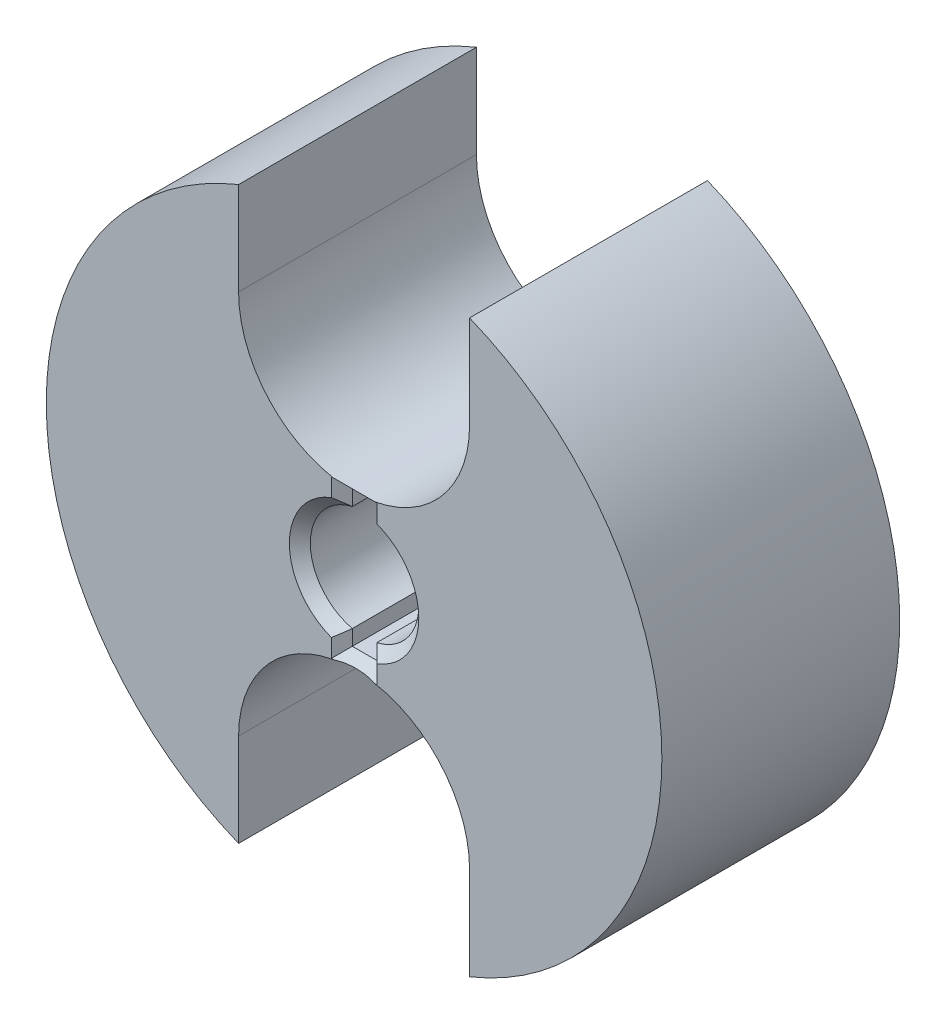
ISO-10303-21;
HEADER;
FILE_DESCRIPTION(('STEP AP214'),'2;1');
FILE_NAME('part.step','',(''),(''),'','','');
FILE_SCHEMA(('AUTOMOTIVE_DESIGN { 1 0 10303 214 1 1 1 1 }'));
ENDSEC;
DATA;
#1=APPLICATION_CONTEXT('core data for automotive mechanical design processes');
#2=APPLICATION_PROTOCOL_DEFINITION('international standard','automotive_design',2000,#1);
#3=PRODUCT_CONTEXT('',#1,'mechanical');
#4=PRODUCT('Part','Part','',(#3));
#5=PRODUCT_RELATED_PRODUCT_CATEGORY('part','',(#4));
#6=PRODUCT_DEFINITION_FORMATION('','',#4);
#7=PRODUCT_DEFINITION_CONTEXT('part definition',#1,'design');
#8=PRODUCT_DEFINITION('design','',#6,#7);
#9=PRODUCT_DEFINITION_SHAPE('','',#8);
#10=(LENGTH_UNIT() NAMED_UNIT(*) SI_UNIT(.MILLI.,.METRE.));
#11=(NAMED_UNIT(*) PLANE_ANGLE_UNIT() SI_UNIT($,.RADIAN.));
#12=(NAMED_UNIT(*) SI_UNIT($,.STERADIAN.) SOLID_ANGLE_UNIT());
#13=UNCERTAINTY_MEASURE_WITH_UNIT(LENGTH_MEASURE(1.E-05),#10,'distance_accuracy_value','');
#14=(GEOMETRIC_REPRESENTATION_CONTEXT(3) GLOBAL_UNCERTAINTY_ASSIGNED_CONTEXT((#13)) GLOBAL_UNIT_ASSIGNED_CONTEXT((#10,
#11,#12)) REPRESENTATION_CONTEXT('',''));
#15=CARTESIAN_POINT('',(0.,0.,0.));
#16=DIRECTION('',(0.,0.,1.));
#17=DIRECTION('',(1.,0.,0.));
#18=AXIS2_PLACEMENT_3D('',#15,#16,#17);
#19=CARTESIAN_POINT('',(0.,0.,17.));
#20=DIRECTION('',(0.,0.,1.));
#21=DIRECTION('',(1.,0.,0.));
#22=AXIS2_PLACEMENT_3D('',#19,#20,#21);
#23=PLANE('',#22);
#24=DIRECTION('',(0.,-1.,0.));
#25=VECTOR('',#24,1.);
#26=CARTESIAN_POINT('',(1.62499999999998,-4.875,17.));
#27=LINE('',#26,#25);
#28=CARTESIAN_POINT('',(1.62499999999998,-4.33012701892218,17.));
#29=VERTEX_POINT('',#28);
#30=CARTESIAN_POINT('',(1.62499999999998,-5.62499999999998,17.));
#31=VERTEX_POINT('',#30);
#32=EDGE_CURVE('E551',#29,#31,#27,.T.);
#33=ORIENTED_EDGE('',*,*,#32,.T.);
#34=DIRECTION('',(-1.,0.,0.));
#35=VECTOR('',#34,1.);
#36=CARTESIAN_POINT('',(0.,-5.62499999999998,17.));
#37=LINE('',#36,#35);
#38=CARTESIAN_POINT('',(1.48681707011984,-5.62499999999998,17.));
#39=VERTEX_POINT('',#38);
#40=EDGE_CURVE('E554',#31,#39,#37,.T.);
#41=ORIENTED_EDGE('',*,*,#40,.T.);
#42=CARTESIAN_POINT('',(0.,-13.745,17.));
#43=DIRECTION('',(0.,0.,1.));
#44=DIRECTION('',(1.,0.,0.));
#45=AXIS2_PLACEMENT_3D('',#42,#43,#44);
#46=CIRCLE('',#45,8.255);
#47=CARTESIAN_POINT('',(8.255,-13.745,17.));
#48=VERTEX_POINT('',#47);
#49=EDGE_CURVE('E275',#48,#39,#46,.T.);
#50=ORIENTED_EDGE('',*,*,#49,.F.);
#51=DIRECTION('',(0.,-1.,0.));
#52=VECTOR('',#51,1.);
#53=CARTESIAN_POINT('',(8.255,0.,17.));
#54=LINE('',#53,#52);
#55=CARTESIAN_POINT('',(8.25500000000001,-20.3925225266518,17.));
#56=VERTEX_POINT('',#55);
#57=EDGE_CURVE('E281',#48,#56,#54,.T.);
#58=ORIENTED_EDGE('',*,*,#57,.T.);
#59=CARTESIAN_POINT('',(0.,0.,17.));
#60=DIRECTION('',(0.,0.,1.));
#61=DIRECTION('',(1.,0.,0.));
#62=AXIS2_PLACEMENT_3D('',#59,#60,#61);
#63=CIRCLE('',#62,22.);
#64=CARTESIAN_POINT('',(8.255,20.3925225266518,17.));
#65=VERTEX_POINT('',#64);
#66=EDGE_CURVE('E285',#56,#65,#63,.T.);
#67=ORIENTED_EDGE('',*,*,#66,.T.);
#68=CARTESIAN_POINT('',(8.255,13.745,17.));
#69=VERTEX_POINT('',#68);
#70=EDGE_CURVE('E286',#65,#69,#54,.T.);
#71=ORIENTED_EDGE('',*,*,#70,.T.);
#72=CARTESIAN_POINT('',(0.,13.745,17.));
#73=DIRECTION('',(0.,0.,1.));
#74=DIRECTION('',(1.,0.,0.));
#75=AXIS2_PLACEMENT_3D('',#72,#73,#74);
#76=CIRCLE('',#75,8.255);
#77=CARTESIAN_POINT('',(1.48681707011984,5.62499999999998,17.));
#78=VERTEX_POINT('',#77);
#79=EDGE_CURVE('E292',#78,#69,#76,.T.);
#80=ORIENTED_EDGE('',*,*,#79,.F.);
#81=DIRECTION('',(1.,0.,0.));
#82=VECTOR('',#81,1.);
#83=CARTESIAN_POINT('',(0.874999999999999,5.62499999999998,17.));
#84=LINE('',#83,#82);
#85=CARTESIAN_POINT('',(1.62499999999998,5.62499999999998,17.));
#86=VERTEX_POINT('',#85);
#87=EDGE_CURVE('E542',#78,#86,#84,.T.);
#88=ORIENTED_EDGE('',*,*,#87,.T.);
#89=DIRECTION('',(0.,-1.,0.));
#90=VECTOR('',#89,1.);
#91=CARTESIAN_POINT('',(1.62499999999998,3.77491721763537,17.));
#92=LINE('',#91,#90);
#93=CARTESIAN_POINT('',(1.62499999999998,4.33012701892218,17.));
#94=VERTEX_POINT('',#93);
#95=EDGE_CURVE('E545',#86,#94,#92,.T.);
#96=ORIENTED_EDGE('',*,*,#95,.T.);
#97=CARTESIAN_POINT('',(0.,0.,17.));
#98=DIRECTION('',(0.,0.,1.));
#99=DIRECTION('',(1.,0.,0.));
#100=AXIS2_PLACEMENT_3D('',#97,#98,#99);
#101=CIRCLE('',#100,4.62499999999998);
#102=EDGE_CURVE('E548',#94,#29,#101,.F.);
#103=ORIENTED_EDGE('',*,*,#102,.T.);
#104=EDGE_LOOP('',(#33,#41,#50,#58,#67,#71,#80,#88,#96,#103));
#105=FACE_BOUND('',#104,.T.);
#106=ADVANCED_FACE('F47',(#105),#23,.T.);
#107=CARTESIAN_POINT('',(0.,0.,0.));
#108=DIRECTION('',(0.,0.,1.));
#109=DIRECTION('',(1.,0.,0.));
#110=AXIS2_PLACEMENT_3D('',#107,#108,#109);
#111=PLANE('',#110);
#112=DIRECTION('',(0.,-1.,0.));
#113=VECTOR('',#112,1.);
#114=CARTESIAN_POINT('',(-1.625,-4.875,0.));
#115=LINE('',#114,#113);
#116=CARTESIAN_POINT('',(-1.625,-4.3301270189222,0.));
#117=VERTEX_POINT('',#116);
#118=CARTESIAN_POINT('',(-1.625,-5.625,0.));
#119=VERTEX_POINT('',#118);
#120=EDGE_CURVE('E386',#117,#119,#115,.T.);
#121=ORIENTED_EDGE('',*,*,#120,.T.);
#122=DIRECTION('',(1.,0.,0.));
#123=VECTOR('',#122,1.);
#124=CARTESIAN_POINT('',(0.875000000000001,-5.625,0.));
#125=LINE('',#124,#123);
#126=CARTESIAN_POINT('',(-1.48681707011996,-5.625,0.));
#127=VERTEX_POINT('',#126);
#128=EDGE_CURVE('E389',#119,#127,#125,.T.);
#129=ORIENTED_EDGE('',*,*,#128,.T.);
#130=CARTESIAN_POINT('',(0.,-13.745,0.));
#131=DIRECTION('',(0.,0.,1.));
#132=DIRECTION('',(1.,0.,0.));
#133=AXIS2_PLACEMENT_3D('',#130,#131,#132);
#134=CIRCLE('',#133,8.255);
#135=CARTESIAN_POINT('',(-8.255,-13.745,0.));
#136=VERTEX_POINT('',#135);
#137=EDGE_CURVE('E305',#127,#136,#134,.T.);
#138=ORIENTED_EDGE('',*,*,#137,.T.);
#139=DIRECTION('',(0.,-1.,0.));
#140=VECTOR('',#139,1.);
#141=CARTESIAN_POINT('',(-8.255,0.,0.));
#142=LINE('',#141,#140);
#143=CARTESIAN_POINT('',(-8.255,-20.3925225266518,0.));
#144=VERTEX_POINT('',#143);
#145=EDGE_CURVE('E297',#136,#144,#142,.T.);
#146=ORIENTED_EDGE('',*,*,#145,.T.);
#147=CARTESIAN_POINT('',(0.,0.,0.));
#148=DIRECTION('',(0.,0.,1.));
#149=DIRECTION('',(1.,0.,0.));
#150=AXIS2_PLACEMENT_3D('',#147,#148,#149);
#151=CIRCLE('',#150,22.);
#152=CARTESIAN_POINT('',(-8.255,20.3925225266518,0.));
#153=VERTEX_POINT('',#152);
#154=EDGE_CURVE('E295',#153,#144,#151,.T.);
#155=ORIENTED_EDGE('',*,*,#154,.F.);
#156=CARTESIAN_POINT('',(-8.255,13.745,0.));
#157=VERTEX_POINT('',#156);
#158=EDGE_CURVE('E242',#153,#157,#142,.T.);
#159=ORIENTED_EDGE('',*,*,#158,.T.);
#160=CARTESIAN_POINT('',(0.,13.745,0.));
#161=DIRECTION('',(0.,0.,1.));
#162=DIRECTION('',(1.,0.,0.));
#163=AXIS2_PLACEMENT_3D('',#160,#161,#162);
#164=CIRCLE('',#163,8.255);
#165=CARTESIAN_POINT('',(-1.48681707011995,5.625,0.));
#166=VERTEX_POINT('',#165);
#167=EDGE_CURVE('E264',#157,#166,#164,.T.);
#168=ORIENTED_EDGE('',*,*,#167,.T.);
#169=DIRECTION('',(-1.,0.,0.));
#170=VECTOR('',#169,1.);
#171=CARTESIAN_POINT('',(0.,5.625,0.));
#172=LINE('',#171,#170);
#173=CARTESIAN_POINT('',(-1.62500000000001,5.625,0.));
#174=VERTEX_POINT('',#173);
#175=EDGE_CURVE('E377',#166,#174,#172,.T.);
#176=ORIENTED_EDGE('',*,*,#175,.T.);
#177=DIRECTION('',(0.,-1.,0.));
#178=VECTOR('',#177,1.);
#179=CARTESIAN_POINT('',(-1.625,3.77491721763537,0.));
#180=LINE('',#179,#178);
#181=CARTESIAN_POINT('',(-1.625,4.3301270189222,0.));
#182=VERTEX_POINT('',#181);
#183=EDGE_CURVE('E380',#174,#182,#180,.T.);
#184=ORIENTED_EDGE('',*,*,#183,.T.);
#185=CARTESIAN_POINT('',(0.,0.,0.));
#186=DIRECTION('',(0.,0.,1.));
#187=DIRECTION('',(1.,0.,0.));
#188=AXIS2_PLACEMENT_3D('',#185,#186,#187);
#189=CIRCLE('',#188,4.625);
#190=EDGE_CURVE('E383',#182,#117,#189,.T.);
#191=ORIENTED_EDGE('',*,*,#190,.T.);
#192=EDGE_LOOP('',(#121,#129,#138,#146,#155,#159,#168,#176,#184,#191));
#193=FACE_BOUND('',#192,.T.);
#194=ADVANCED_FACE('F679',(#193),#111,.F.);
#195=CARTESIAN_POINT('',(0.,0.,17.));
#196=DIRECTION('',(0.,0.,-1.));
#197=DIRECTION('',(-1.,0.,0.));
#198=AXIS2_PLACEMENT_3D('',#195,#196,#197);
#199=CYLINDRICAL_SURFACE('',#198,3.875);
#200=DIRECTION('',(0.,0.,-1.));
#201=VECTOR('',#200,1.);
#202=CARTESIAN_POINT('',(-0.875000000000001,3.77491721763537,17.));
#203=LINE('',#202,#201);
#204=CARTESIAN_POINT('',(-0.875000000000001,3.77491721763537,16.25));
#205=VERTEX_POINT('',#204);
#206=CARTESIAN_POINT('',(-0.875000000000001,3.77491721763537,0.750000000000004));
#207=VERTEX_POINT('',#206);
#208=EDGE_CURVE('E332',#205,#207,#203,.T.);
#209=ORIENTED_EDGE('',*,*,#208,.F.);
#210=CARTESIAN_POINT('',(0.,0.,16.25));
#211=DIRECTION('',(0.,0.,1.));
#212=DIRECTION('',(1.,0.,0.));
#213=AXIS2_PLACEMENT_3D('',#210,#211,#212);
#214=CIRCLE('',#213,3.875);
#215=CARTESIAN_POINT('',(-0.875,-3.77491721763537,16.25));
#216=VERTEX_POINT('',#215);
#217=EDGE_CURVE('E11',#205,#216,#214,.T.);
#218=ORIENTED_EDGE('',*,*,#217,.T.);
#219=DIRECTION('',(0.,0.,-1.));
#220=VECTOR('',#219,1.);
#221=CARTESIAN_POINT('',(-0.875,-3.77491721763537,17.));
#222=LINE('',#221,#220);
#223=CARTESIAN_POINT('',(-0.875,-3.77491721763537,0.750000000000004));
#224=VERTEX_POINT('',#223);
#225=EDGE_CURVE('E247',#216,#224,#222,.T.);
#226=ORIENTED_EDGE('',*,*,#225,.T.);
#227=CARTESIAN_POINT('',(0.,0.,0.750000000000004));
#228=DIRECTION('',(0.,0.,1.));
#229=DIRECTION('',(1.,0.,0.));
#230=AXIS2_PLACEMENT_3D('',#227,#228,#229);
#231=CIRCLE('',#230,3.875);
#232=EDGE_CURVE('E403',#224,#207,#231,.F.);
#233=ORIENTED_EDGE('',*,*,#232,.T.);
#234=EDGE_LOOP('',(#209,#218,#226,#233));
#235=FACE_BOUND('',#234,.T.);
#236=ADVANCED_FACE('F746',(#235),#199,.F.);
#237=CARTESIAN_POINT('',(-0.875,0.,17.));
#238=DIRECTION('',(1.,0.,0.));
#239=DIRECTION('',(0.,1.,0.));
#240=AXIS2_PLACEMENT_3D('',#237,#238,#239);
#241=PLANE('',#240);
#242=DIRECTION('',(0.,0.,-1.));
#243=VECTOR('',#242,1.);
#244=CARTESIAN_POINT('',(-0.875000000000001,4.875,17.));
#245=LINE('',#244,#243);
#246=CARTESIAN_POINT('',(-0.875000000000001,4.875,16.25));
#247=VERTEX_POINT('',#246);
#248=CARTESIAN_POINT('',(-0.875000000000001,4.875,0.750000000000004));
#249=VERTEX_POINT('',#248);
#250=EDGE_CURVE('E329',#247,#249,#245,.T.);
#251=ORIENTED_EDGE('',*,*,#250,.F.);
#252=DIRECTION('',(0.,-1.,0.));
#253=VECTOR('',#252,1.);
#254=CARTESIAN_POINT('',(-0.875,0.,16.25));
#255=LINE('',#254,#253);
#256=EDGE_CURVE('E58',#247,#205,#255,.T.);
#257=ORIENTED_EDGE('',*,*,#256,.T.);
#258=ORIENTED_EDGE('',*,*,#208,.T.);
#259=DIRECTION('',(0.,1.,0.));
#260=VECTOR('',#259,1.);
#261=CARTESIAN_POINT('',(-0.875000000000001,4.875,0.750000000000004));
#262=LINE('',#261,#260);
#263=EDGE_CURVE('E407',#207,#249,#262,.T.);
#264=ORIENTED_EDGE('',*,*,#263,.T.);
#265=EDGE_LOOP('',(#251,#257,#258,#264));
#266=FACE_BOUND('',#265,.T.);
#267=ADVANCED_FACE('F749',(#266),#241,.T.);
#268=CARTESIAN_POINT('',(0.,4.875,17.));
#269=DIRECTION('',(0.,1.,0.));
#270=DIRECTION('',(0.,0.,1.));
#271=AXIS2_PLACEMENT_3D('',#268,#269,#270);
#272=PLANE('',#271);
#273=DIRECTION('',(0.,0.,-1.));
#274=VECTOR('',#273,1.);
#275=CARTESIAN_POINT('',(0.874999999999999,4.875,17.));
#276=LINE('',#275,#274);
#277=CARTESIAN_POINT('',(0.874999999999999,4.875,16.25));
#278=VERTEX_POINT('',#277);
#279=CARTESIAN_POINT('',(0.874999999999999,4.875,0.750000000000004));
#280=VERTEX_POINT('',#279);
#281=EDGE_CURVE('E326',#278,#280,#276,.T.);
#282=ORIENTED_EDGE('',*,*,#281,.F.);
#283=DIRECTION('',(-1.,0.,0.));
#284=VECTOR('',#283,1.);
#285=CARTESIAN_POINT('',(-0.875000000000001,4.875,16.25));
#286=LINE('',#285,#284);
#287=EDGE_CURVE('E73',#278,#247,#286,.T.);
#288=ORIENTED_EDGE('',*,*,#287,.T.);
#289=ORIENTED_EDGE('',*,*,#250,.T.);
#290=DIRECTION('',(1.,0.,0.));
#291=VECTOR('',#290,1.);
#292=CARTESIAN_POINT('',(0.,4.875,0.750000000000004));
#293=LINE('',#292,#291);
#294=EDGE_CURVE('E411',#249,#280,#293,.T.);
#295=ORIENTED_EDGE('',*,*,#294,.T.);
#296=EDGE_LOOP('',(#282,#288,#289,#295));
#297=FACE_BOUND('',#296,.T.);
#298=ADVANCED_FACE('F750',(#297),#272,.F.);
#299=CARTESIAN_POINT('',(0.875,0.,17.));
#300=DIRECTION('',(1.,0.,0.));
#301=DIRECTION('',(0.,1.,0.));
#302=AXIS2_PLACEMENT_3D('',#299,#300,#301);
#303=PLANE('',#302);
#304=DIRECTION('',(0.,0.,-1.));
#305=VECTOR('',#304,1.);
#306=CARTESIAN_POINT('',(0.874999999999999,3.77491721763537,17.));
#307=LINE('',#306,#305);
#308=CARTESIAN_POINT('',(0.874999999999999,3.77491721763537,16.25));
#309=VERTEX_POINT('',#308);
#310=CARTESIAN_POINT('',(0.874999999999999,3.77491721763537,0.750000000000004));
#311=VERTEX_POINT('',#310);
#312=EDGE_CURVE('E323',#309,#311,#307,.T.);
#313=ORIENTED_EDGE('',*,*,#312,.F.);
#314=DIRECTION('',(0.,1.,0.));
#315=VECTOR('',#314,1.);
#316=CARTESIAN_POINT('',(0.874999999999999,4.875,16.25));
#317=LINE('',#316,#315);
#318=EDGE_CURVE('E569',#309,#278,#317,.T.);
#319=ORIENTED_EDGE('',*,*,#318,.T.);
#320=ORIENTED_EDGE('',*,*,#281,.T.);
#321=DIRECTION('',(0.,-1.,0.));
#322=VECTOR('',#321,1.);
#323=CARTESIAN_POINT('',(0.875,0.,0.750000000000004));
#324=LINE('',#323,#322);
#325=EDGE_CURVE('E418',#280,#311,#324,.T.);
#326=ORIENTED_EDGE('',*,*,#325,.T.);
#327=EDGE_LOOP('',(#313,#319,#320,#326));
#328=FACE_BOUND('',#327,.T.);
#329=ADVANCED_FACE('F779',(#328),#303,.F.);
#330=DIRECTION('',(0.,0.,-1.));
#331=VECTOR('',#330,1.);
#332=CARTESIAN_POINT('',(0.875,-3.77491721763537,17.));
#333=LINE('',#332,#331);
#334=CARTESIAN_POINT('',(0.875,-3.77491721763537,16.25));
#335=VERTEX_POINT('',#334);
#336=CARTESIAN_POINT('',(0.875,-3.77491721763537,0.750000000000004));
#337=VERTEX_POINT('',#336);
#338=EDGE_CURVE('E320',#335,#337,#333,.T.);
#339=ORIENTED_EDGE('',*,*,#338,.F.);
#340=CARTESIAN_POINT('',(0.,0.,16.25));
#341=DIRECTION('',(0.,0.,1.));
#342=DIRECTION('',(1.,0.,0.));
#343=AXIS2_PLACEMENT_3D('',#340,#341,#342);
#344=CIRCLE('',#343,3.875);
#345=EDGE_CURVE('E566',#335,#309,#344,.T.);
#346=ORIENTED_EDGE('',*,*,#345,.T.);
#347=ORIENTED_EDGE('',*,*,#312,.T.);
#348=CARTESIAN_POINT('',(0.,0.,0.750000000000004));
#349=DIRECTION('',(0.,0.,1.));
#350=DIRECTION('',(1.,0.,0.));
#351=AXIS2_PLACEMENT_3D('',#348,#349,#350);
#352=CIRCLE('',#351,3.875);
#353=EDGE_CURVE('E422',#311,#337,#352,.F.);
#354=ORIENTED_EDGE('',*,*,#353,.T.);
#355=EDGE_LOOP('',(#339,#346,#347,#354));
#356=FACE_BOUND('',#355,.T.);
#357=ADVANCED_FACE('F782',(#356),#199,.F.);
#358=DIRECTION('',(0.,0.,-1.));
#359=VECTOR('',#358,1.);
#360=CARTESIAN_POINT('',(0.875000000000001,-4.875,17.));
#361=LINE('',#360,#359);
#362=CARTESIAN_POINT('',(0.875000000000001,-4.875,16.25));
#363=VERTEX_POINT('',#362);
#364=CARTESIAN_POINT('',(0.875000000000001,-4.875,0.750000000000004));
#365=VERTEX_POINT('',#364);
#366=EDGE_CURVE('E317',#363,#365,#361,.T.);
#367=ORIENTED_EDGE('',*,*,#366,.F.);
#368=DIRECTION('',(0.,1.,0.));
#369=VECTOR('',#368,1.);
#370=CARTESIAN_POINT('',(0.875,-3.77491721763537,16.25));
#371=LINE('',#370,#369);
#372=EDGE_CURVE('E563',#363,#335,#371,.T.);
#373=ORIENTED_EDGE('',*,*,#372,.T.);
#374=ORIENTED_EDGE('',*,*,#338,.T.);
#375=DIRECTION('',(0.,-1.,0.));
#376=VECTOR('',#375,1.);
#377=CARTESIAN_POINT('',(0.875,0.,0.750000000000004));
#378=LINE('',#377,#376);
#379=EDGE_CURVE('E335',#337,#365,#378,.T.);
#380=ORIENTED_EDGE('',*,*,#379,.T.);
#381=EDGE_LOOP('',(#367,#373,#374,#380));
#382=FACE_BOUND('',#381,.T.);
#383=ADVANCED_FACE('F787',(#382),#303,.F.);
#384=CARTESIAN_POINT('',(0.,-4.875,17.));
#385=DIRECTION('',(0.,1.,0.));
#386=DIRECTION('',(0.,0.,1.));
#387=AXIS2_PLACEMENT_3D('',#384,#385,#386);
#388=PLANE('',#387);
#389=DIRECTION('',(0.,0.,-1.));
#390=VECTOR('',#389,1.);
#391=CARTESIAN_POINT('',(-0.874999999999999,-4.875,17.));
#392=LINE('',#391,#390);
#393=CARTESIAN_POINT('',(-0.874999999999999,-4.875,16.25));
#394=VERTEX_POINT('',#393);
#395=CARTESIAN_POINT('',(-0.874999999999999,-4.875,0.750000000000004));
#396=VERTEX_POINT('',#395);
#397=EDGE_CURVE('E314',#394,#396,#392,.T.);
#398=ORIENTED_EDGE('',*,*,#397,.F.);
#399=DIRECTION('',(1.,0.,0.));
#400=VECTOR('',#399,1.);
#401=CARTESIAN_POINT('',(0.,-4.875,16.25));
#402=LINE('',#401,#400);
#403=EDGE_CURVE('E557',#394,#363,#402,.T.);
#404=ORIENTED_EDGE('',*,*,#403,.T.);
#405=ORIENTED_EDGE('',*,*,#366,.T.);
#406=DIRECTION('',(-1.,0.,0.));
#407=VECTOR('',#406,1.);
#408=CARTESIAN_POINT('',(-0.874999999999999,-4.875,0.750000000000004));
#409=LINE('',#408,#407);
#410=EDGE_CURVE('E395',#365,#396,#409,.T.);
#411=ORIENTED_EDGE('',*,*,#410,.T.);
#412=EDGE_LOOP('',(#398,#404,#405,#411));
#413=FACE_BOUND('',#412,.T.);
#414=ADVANCED_FACE('F793',(#413),#388,.T.);
#415=CARTESIAN_POINT('',(-8.255,0.,17.));
#416=DIRECTION('',(1.,0.,0.));
#417=DIRECTION('',(0.,1.,0.));
#418=AXIS2_PLACEMENT_3D('',#415,#416,#417);
#419=PLANE('',#418);
#420=ORIENTED_EDGE('',*,*,#158,.F.);
#421=DIRECTION('',(0.,0.,-1.));
#422=VECTOR('',#421,1.);
#423=CARTESIAN_POINT('',(-8.255,20.3925225266518,17.));
#424=LINE('',#423,#422);
#425=CARTESIAN_POINT('',(-8.255,20.3925225266518,17.));
#426=VERTEX_POINT('',#425);
#427=EDGE_CURVE('E235',#426,#153,#424,.T.);
#428=ORIENTED_EDGE('',*,*,#427,.F.);
#429=DIRECTION('',(0.,-1.,0.));
#430=VECTOR('',#429,1.);
#431=CARTESIAN_POINT('',(-8.255,0.,17.));
#432=LINE('',#431,#430);
#433=CARTESIAN_POINT('',(-8.255,13.745,17.));
#434=VERTEX_POINT('',#433);
#435=EDGE_CURVE('E239',#426,#434,#432,.T.);
#436=ORIENTED_EDGE('',*,*,#435,.T.);
#437=DIRECTION('',(0.,0.,-1.));
#438=VECTOR('',#437,1.);
#439=CARTESIAN_POINT('',(-8.255,13.745,17.));
#440=LINE('',#439,#438);
#441=EDGE_CURVE('E291',#434,#157,#440,.T.);
#442=ORIENTED_EDGE('',*,*,#441,.T.);
#443=EDGE_LOOP('',(#420,#428,#436,#442));
#444=FACE_BOUND('',#443,.T.);
#445=ADVANCED_FACE('F237',(#444),#419,.T.);
#446=CARTESIAN_POINT('',(0.,0.,17.));
#447=DIRECTION('',(0.,0.,-1.));
#448=DIRECTION('',(-1.,0.,0.));
#449=AXIS2_PLACEMENT_3D('',#446,#447,#448);
#450=CYLINDRICAL_SURFACE('',#449,22.);
#451=ORIENTED_EDGE('',*,*,#154,.T.);
#452=DIRECTION('',(0.,0.,-1.));
#453=VECTOR('',#452,1.);
#454=CARTESIAN_POINT('',(-8.255,-20.3925225266518,17.));
#455=LINE('',#454,#453);
#456=CARTESIAN_POINT('',(-8.255,-20.3925225266518,17.));
#457=VERTEX_POINT('',#456);
#458=EDGE_CURVE('E248',#457,#144,#455,.T.);
#459=ORIENTED_EDGE('',*,*,#458,.F.);
#460=CARTESIAN_POINT('',(0.,0.,17.));
#461=DIRECTION('',(0.,0.,1.));
#462=DIRECTION('',(1.,0.,0.));
#463=AXIS2_PLACEMENT_3D('',#460,#461,#462);
#464=CIRCLE('',#463,22.);
#465=EDGE_CURVE('E251',#426,#457,#464,.T.);
#466=ORIENTED_EDGE('',*,*,#465,.F.);
#467=ORIENTED_EDGE('',*,*,#427,.T.);
#468=EDGE_LOOP('',(#451,#459,#466,#467));
#469=FACE_BOUND('',#468,.T.);
#470=ADVANCED_FACE('F252',(#469),#450,.T.);
#471=ORIENTED_EDGE('',*,*,#145,.F.);
#472=DIRECTION('',(0.,0.,-1.));
#473=VECTOR('',#472,1.);
#474=CARTESIAN_POINT('',(-8.255,-13.745,17.));
#475=LINE('',#474,#473);
#476=CARTESIAN_POINT('',(-8.255,-13.745,17.));
#477=VERTEX_POINT('',#476);
#478=EDGE_CURVE('E353',#477,#136,#475,.T.);
#479=ORIENTED_EDGE('',*,*,#478,.F.);
#480=EDGE_CURVE('E257',#477,#457,#432,.T.);
#481=ORIENTED_EDGE('',*,*,#480,.T.);
#482=ORIENTED_EDGE('',*,*,#458,.T.);
#483=EDGE_LOOP('',(#471,#479,#481,#482));
#484=FACE_BOUND('',#483,.T.);
#485=ADVANCED_FACE('F818',(#484),#419,.T.);
#486=CARTESIAN_POINT('',(0.,-13.745,17.));
#487=DIRECTION('',(0.,0.,-1.));
#488=DIRECTION('',(-1.,0.,0.));
#489=AXIS2_PLACEMENT_3D('',#486,#487,#488);
#490=CYLINDRICAL_SURFACE('',#489,8.255);
#491=ORIENTED_EDGE('',*,*,#49,.T.);
#492=CARTESIAN_POINT('',(0.,-13.745,25.12));
#493=DIRECTION('',(0.,-0.707106781186547,-0.707106781186547));
#494=DIRECTION('',(0.,0.707106781186548,-0.707106781186548));
#495=AXIS2_PLACEMENT_3D('',#492,#493,#494);
#496=ELLIPSE('',#495,11.6743329573899,8.255);
#497=CARTESIAN_POINT('',(-1.48681707011984,-5.62499999999998,17.));
#498=VERTEX_POINT('',#497);
#499=EDGE_CURVE('E560',#39,#498,#496,.F.);
#500=ORIENTED_EDGE('',*,*,#499,.T.);
#501=EDGE_CURVE('E271',#498,#477,#46,.T.);
#502=ORIENTED_EDGE('',*,*,#501,.T.);
#503=ORIENTED_EDGE('',*,*,#478,.T.);
#504=ORIENTED_EDGE('',*,*,#137,.F.);
#505=CARTESIAN_POINT('',(0.,-13.745,-8.12));
#506=DIRECTION('',(0.,0.707106781186548,-0.707106781186548));
#507=DIRECTION('',(0.,-0.707106781186548,-0.707106781186548));
#508=AXIS2_PLACEMENT_3D('',#505,#506,#507);
#509=ELLIPSE('',#508,11.6743329573899,8.255);
#510=CARTESIAN_POINT('',(1.48681707011996,-5.625,0.));
#511=VERTEX_POINT('',#510);
#512=EDGE_CURVE('E392',#127,#511,#509,.T.);
#513=ORIENTED_EDGE('',*,*,#512,.T.);
#514=CARTESIAN_POINT('',(8.255,-13.745,0.));
#515=VERTEX_POINT('',#514);
#516=EDGE_CURVE('E300',#515,#511,#134,.T.);
#517=ORIENTED_EDGE('',*,*,#516,.F.);
#518=DIRECTION('',(0.,0.,-1.));
#519=VECTOR('',#518,1.);
#520=CARTESIAN_POINT('',(8.255,-13.745,17.));
#521=LINE('',#520,#519);
#522=EDGE_CURVE('E350',#48,#515,#521,.T.);
#523=ORIENTED_EDGE('',*,*,#522,.F.);
#524=EDGE_LOOP('',(#491,#500,#502,#503,#504,#513,#517,#523));
#525=FACE_BOUND('',#524,.T.);
#526=ADVANCED_FACE('F709',(#525),#490,.F.);
#527=CARTESIAN_POINT('',(8.255,0.,17.));
#528=DIRECTION('',(1.,0.,0.));
#529=DIRECTION('',(0.,1.,0.));
#530=AXIS2_PLACEMENT_3D('',#527,#528,#529);
#531=PLANE('',#530);
#532=DIRECTION('',(0.,-1.,0.));
#533=VECTOR('',#532,1.);
#534=CARTESIAN_POINT('',(8.255,0.,0.));
#535=LINE('',#534,#533);
#536=CARTESIAN_POINT('',(8.25500000000001,-20.3925225266518,0.));
#537=VERTEX_POINT('',#536);
#538=EDGE_CURVE('E304',#515,#537,#535,.T.);
#539=ORIENTED_EDGE('',*,*,#538,.T.);
#540=DIRECTION('',(0.,0.,-1.));
#541=VECTOR('',#540,1.);
#542=CARTESIAN_POINT('',(8.25500000000001,-20.3925225266518,17.));
#543=LINE('',#542,#541);
#544=EDGE_CURVE('E346',#56,#537,#543,.T.);
#545=ORIENTED_EDGE('',*,*,#544,.F.);
#546=ORIENTED_EDGE('',*,*,#57,.F.);
#547=ORIENTED_EDGE('',*,*,#522,.T.);
#548=EDGE_LOOP('',(#539,#545,#546,#547));
#549=FACE_BOUND('',#548,.T.);
#550=ADVANCED_FACE('F809',(#549),#531,.F.);
#551=CARTESIAN_POINT('',(0.,0.,17.));
#552=DIRECTION('',(0.,0.,-1.));
#553=DIRECTION('',(-1.,0.,0.));
#554=AXIS2_PLACEMENT_3D('',#551,#552,#553);
#555=CYLINDRICAL_SURFACE('',#554,22.);
#556=CARTESIAN_POINT('',(0.,0.,0.));
#557=DIRECTION('',(0.,0.,1.));
#558=DIRECTION('',(1.,0.,0.));
#559=AXIS2_PLACEMENT_3D('',#556,#557,#558);
#560=CIRCLE('',#559,22.);
#561=CARTESIAN_POINT('',(8.255,20.3925225266518,0.));
#562=VERTEX_POINT('',#561);
#563=EDGE_CURVE('E308',#537,#562,#560,.T.);
#564=ORIENTED_EDGE('',*,*,#563,.T.);
#565=DIRECTION('',(0.,0.,-1.));
#566=VECTOR('',#565,1.);
#567=CARTESIAN_POINT('',(8.255,20.3925225266518,17.));
#568=LINE('',#567,#566);
#569=EDGE_CURVE('E342',#65,#562,#568,.T.);
#570=ORIENTED_EDGE('',*,*,#569,.F.);
#571=ORIENTED_EDGE('',*,*,#66,.F.);
#572=ORIENTED_EDGE('',*,*,#544,.T.);
#573=EDGE_LOOP('',(#564,#570,#571,#572));
#574=FACE_BOUND('',#573,.T.);
#575=ADVANCED_FACE('F703',(#574),#555,.T.);
#576=CARTESIAN_POINT('',(8.255,13.745,0.));
#577=VERTEX_POINT('',#576);
#578=EDGE_CURVE('E309',#562,#577,#535,.T.);
#579=ORIENTED_EDGE('',*,*,#578,.T.);
#580=DIRECTION('',(0.,0.,-1.));
#581=VECTOR('',#580,1.);
#582=CARTESIAN_POINT('',(8.255,13.745,17.));
#583=LINE('',#582,#581);
#584=EDGE_CURVE('E338',#69,#577,#583,.T.);
#585=ORIENTED_EDGE('',*,*,#584,.F.);
#586=ORIENTED_EDGE('',*,*,#70,.F.);
#587=ORIENTED_EDGE('',*,*,#569,.T.);
#588=EDGE_LOOP('',(#579,#585,#586,#587));
#589=FACE_BOUND('',#588,.T.);
#590=ADVANCED_FACE('F699',(#589),#531,.F.);
#591=CARTESIAN_POINT('',(0.,13.745,17.));
#592=DIRECTION('',(0.,0.,-1.));
#593=DIRECTION('',(-1.,0.,0.));
#594=AXIS2_PLACEMENT_3D('',#591,#592,#593);
#595=CYLINDRICAL_SURFACE('',#594,8.255);
#596=CARTESIAN_POINT('',(-1.48681707011984,5.62499999999998,17.));
#597=VERTEX_POINT('',#596);
#598=EDGE_CURVE('E262',#434,#597,#76,.T.);
#599=ORIENTED_EDGE('',*,*,#598,.T.);
#600=CARTESIAN_POINT('',(0.,13.745,25.12));
#601=DIRECTION('',(0.,-0.707106781186547,0.707106781186547));
#602=DIRECTION('',(0.,-0.707106781186548,-0.707106781186548));
#603=AXIS2_PLACEMENT_3D('',#600,#601,#602);
#604=ELLIPSE('',#603,11.6743329573899,8.255);
#605=EDGE_CURVE('E572',#597,#78,#604,.T.);
#606=ORIENTED_EDGE('',*,*,#605,.T.);
#607=ORIENTED_EDGE('',*,*,#79,.T.);
#608=ORIENTED_EDGE('',*,*,#584,.T.);
#609=CARTESIAN_POINT('',(1.48681707011995,5.625,0.));
#610=VERTEX_POINT('',#609);
#611=EDGE_CURVE('E268',#610,#577,#164,.T.);
#612=ORIENTED_EDGE('',*,*,#611,.F.);
#613=CARTESIAN_POINT('',(0.,13.745,-8.12));
#614=DIRECTION('',(0.,0.707106781186548,0.707106781186548));
#615=DIRECTION('',(0.,0.707106781186548,-0.707106781186548));
#616=AXIS2_PLACEMENT_3D('',#613,#614,#615);
#617=ELLIPSE('',#616,11.6743329573899,8.255);
#618=EDGE_CURVE('E415',#610,#166,#617,.F.);
#619=ORIENTED_EDGE('',*,*,#618,.T.);
#620=ORIENTED_EDGE('',*,*,#167,.F.);
#621=ORIENTED_EDGE('',*,*,#441,.F.);
#622=EDGE_LOOP('',(#599,#606,#607,#608,#612,#619,#620,#621));
#623=FACE_BOUND('',#622,.T.);
#624=ADVANCED_FACE('F675',(#623),#595,.F.);
#625=ORIENTED_EDGE('',*,*,#225,.F.);
#626=DIRECTION('',(0.,-1.,0.));
#627=VECTOR('',#626,1.);
#628=CARTESIAN_POINT('',(-0.875,0.,16.25));
#629=LINE('',#628,#627);
#630=EDGE_CURVE('E426',#216,#394,#629,.T.);
#631=ORIENTED_EDGE('',*,*,#630,.T.);
#632=ORIENTED_EDGE('',*,*,#397,.T.);
#633=DIRECTION('',(0.,1.,0.));
#634=VECTOR('',#633,1.);
#635=CARTESIAN_POINT('',(-0.875,-3.77491721763537,0.750000000000004));
#636=LINE('',#635,#634);
#637=EDGE_CURVE('E399',#396,#224,#636,.T.);
#638=ORIENTED_EDGE('',*,*,#637,.T.);
#639=EDGE_LOOP('',(#625,#631,#632,#638));
#640=FACE_BOUND('',#639,.T.);
#641=ADVANCED_FACE('F738',(#640),#241,.T.);
#642=ORIENTED_EDGE('',*,*,#501,.F.);
#643=DIRECTION('',(-1.,0.,0.));
#644=VECTOR('',#643,1.);
#645=CARTESIAN_POINT('',(0.,-5.62499999999998,17.));
#646=LINE('',#645,#644);
#647=CARTESIAN_POINT('',(-1.62499999999998,-5.62499999999998,17.));
#648=VERTEX_POINT('',#647);
#649=EDGE_CURVE('E539',#498,#648,#646,.T.);
#650=ORIENTED_EDGE('',*,*,#649,.T.);
#651=DIRECTION('',(0.,1.,0.));
#652=VECTOR('',#651,1.);
#653=CARTESIAN_POINT('',(-1.62499999999998,0.,17.));
#654=LINE('',#653,#652);
#655=CARTESIAN_POINT('',(-1.62499999999998,-4.33012701892218,17.));
#656=VERTEX_POINT('',#655);
#657=EDGE_CURVE('E535',#648,#656,#654,.T.);
#658=ORIENTED_EDGE('',*,*,#657,.T.);
#659=CARTESIAN_POINT('',(0.,0.,17.));
#660=DIRECTION('',(0.,0.,1.));
#661=DIRECTION('',(1.,0.,0.));
#662=AXIS2_PLACEMENT_3D('',#659,#660,#661);
#663=CIRCLE('',#662,4.62499999999998);
#664=CARTESIAN_POINT('',(-1.62499999999998,4.33012701892218,17.));
#665=VERTEX_POINT('',#664);
#666=EDGE_CURVE('E526',#656,#665,#663,.F.);
#667=ORIENTED_EDGE('',*,*,#666,.T.);
#668=DIRECTION('',(0.,1.,0.));
#669=VECTOR('',#668,1.);
#670=CARTESIAN_POINT('',(-1.62499999999998,0.,17.));
#671=LINE('',#670,#669);
#672=CARTESIAN_POINT('',(-1.62499999999998,5.62499999999998,17.));
#673=VERTEX_POINT('',#672);
#674=EDGE_CURVE('E529',#665,#673,#671,.T.);
#675=ORIENTED_EDGE('',*,*,#674,.T.);
#676=DIRECTION('',(1.,0.,0.));
#677=VECTOR('',#676,1.);
#678=CARTESIAN_POINT('',(0.874999999999999,5.62499999999998,17.));
#679=LINE('',#678,#677);
#680=EDGE_CURVE('E532',#673,#597,#679,.T.);
#681=ORIENTED_EDGE('',*,*,#680,.T.);
#682=ORIENTED_EDGE('',*,*,#598,.F.);
#683=ORIENTED_EDGE('',*,*,#435,.F.);
#684=ORIENTED_EDGE('',*,*,#465,.T.);
#685=ORIENTED_EDGE('',*,*,#480,.F.);
#686=EDGE_LOOP('',(#642,#650,#658,#667,#675,#681,#682,#683,#684,#685));
#687=FACE_BOUND('',#686,.T.);
#688=ADVANCED_FACE('F260',(#687),#23,.T.);
#689=ORIENTED_EDGE('',*,*,#516,.T.);
#690=DIRECTION('',(1.,0.,0.));
#691=VECTOR('',#690,1.);
#692=CARTESIAN_POINT('',(0.875000000000001,-5.625,0.));
#693=LINE('',#692,#691);
#694=CARTESIAN_POINT('',(1.625,-5.625,0.));
#695=VERTEX_POINT('',#694);
#696=EDGE_CURVE('E374',#511,#695,#693,.T.);
#697=ORIENTED_EDGE('',*,*,#696,.T.);
#698=DIRECTION('',(0.,1.,0.));
#699=VECTOR('',#698,1.);
#700=CARTESIAN_POINT('',(1.625,0.,0.));
#701=LINE('',#700,#699);
#702=CARTESIAN_POINT('',(1.625,-4.3301270189222,0.));
#703=VERTEX_POINT('',#702);
#704=EDGE_CURVE('E370',#695,#703,#701,.T.);
#705=ORIENTED_EDGE('',*,*,#704,.T.);
#706=CARTESIAN_POINT('',(0.,0.,0.));
#707=DIRECTION('',(0.,0.,1.));
#708=DIRECTION('',(1.,0.,0.));
#709=AXIS2_PLACEMENT_3D('',#706,#707,#708);
#710=CIRCLE('',#709,4.625);
#711=CARTESIAN_POINT('',(1.625,4.3301270189222,0.));
#712=VERTEX_POINT('',#711);
#713=EDGE_CURVE('E361',#703,#712,#710,.T.);
#714=ORIENTED_EDGE('',*,*,#713,.T.);
#715=DIRECTION('',(0.,1.,0.));
#716=VECTOR('',#715,1.);
#717=CARTESIAN_POINT('',(1.625,0.,0.));
#718=LINE('',#717,#716);
#719=CARTESIAN_POINT('',(1.625,5.625,0.));
#720=VERTEX_POINT('',#719);
#721=EDGE_CURVE('E364',#712,#720,#718,.T.);
#722=ORIENTED_EDGE('',*,*,#721,.T.);
#723=DIRECTION('',(-1.,0.,0.));
#724=VECTOR('',#723,1.);
#725=CARTESIAN_POINT('',(0.,5.625,0.));
#726=LINE('',#725,#724);
#727=EDGE_CURVE('E367',#720,#610,#726,.T.);
#728=ORIENTED_EDGE('',*,*,#727,.T.);
#729=ORIENTED_EDGE('',*,*,#611,.T.);
#730=ORIENTED_EDGE('',*,*,#578,.F.);
#731=ORIENTED_EDGE('',*,*,#563,.F.);
#732=ORIENTED_EDGE('',*,*,#538,.F.);
#733=EDGE_LOOP('',(#689,#697,#705,#714,#722,#728,#729,#730,#731,#732));
#734=FACE_BOUND('',#733,.T.);
#735=ADVANCED_FACE('F509',(#734),#111,.F.);
#736=CARTESIAN_POINT('',(-1.625,0.,0.));
#737=DIRECTION('',(0.707106781186547,0.,-0.707106781186548));
#738=DIRECTION('',(0.,1.,0.));
#739=AXIS2_PLACEMENT_3D('',#736,#737,#738);
#740=PLANE('',#739);
#741=CARTESIAN_POINT('',(-0.875000000000001,3.77491721763537,0.750000000000004));
#742=CARTESIAN_POINT('',(-0.936516987168864,3.82380267487689,0.688483012831141));
#743=CARTESIAN_POINT('',(-0.998317485976128,3.87197040339965,0.626682514023877));
#744=CARTESIAN_POINT('',(-1.12241802103305,3.96695976082173,0.502581978966959));
#745=CARTESIAN_POINT('',(-1.18471795597451,4.01378165430202,0.440282044025492));
#746=CARTESIAN_POINT('',(-1.30977159253325,4.1061859923186,0.315228407466757));
#747=CARTESIAN_POINT('',(-1.37252527455817,4.15176848997095,0.252474725441836));
#748=CARTESIAN_POINT('',(-1.49845774627077,4.24178834165836,0.126542253729233));
#749=CARTESIAN_POINT('',(-1.56163661762834,4.28622546728782,0.063363382371669));
#750=CARTESIAN_POINT('',(-1.62500000000001,4.3301270189222,0.));
#751=B_SPLINE_CURVE_WITH_KNOTS('',3,(#741,#742,#743,#744,#745,#746,#747,#748,#749,#750),
.UNSPECIFIED.,.F.,.F.,(4,2,2,2,4),(0.,0.299370016419848,0.59868077074671,0.897978677405934,
1.19733581421461),.UNSPECIFIED.);
#752=EDGE_CURVE('E512',#182,#207,#751,.F.);
#753=ORIENTED_EDGE('',*,*,#752,.F.);
#754=ORIENTED_EDGE('',*,*,#183,.F.);
#755=DIRECTION('',(0.577350269189626,-0.577350269189626,0.577350269189626));
#756=VECTOR('',#755,1.);
#757=CARTESIAN_POINT('',(0.249999999999997,3.75,1.875));
#758=LINE('',#757,#756);
#759=EDGE_CURVE('E296',#249,#174,#758,.F.);
#760=ORIENTED_EDGE('',*,*,#759,.F.);
#761=ORIENTED_EDGE('',*,*,#263,.F.);
#762=EDGE_LOOP('',(#753,#754,#760,#761));
#763=FACE_BOUND('',#762,.T.);
#764=ADVANCED_FACE('F501',(#763),#740,.T.);
#765=CARTESIAN_POINT('',(0.,4.875,0.750000000000004));
#766=DIRECTION('',(0.,0.707106781186548,0.707106781186548));
#767=DIRECTION('',(1.,0.,0.));
#768=AXIS2_PLACEMENT_3D('',#765,#766,#767);
#769=PLANE('',#768);
#770=ORIENTED_EDGE('',*,*,#618,.F.);
#771=ORIENTED_EDGE('',*,*,#727,.F.);
#772=DIRECTION('',(0.577350269189626,0.577350269189626,-0.577350269189626));
#773=VECTOR('',#772,1.);
#774=CARTESIAN_POINT('',(0.583333333333333,4.58333333333333,1.04166666666667));
#775=LINE('',#774,#773);
#776=EDGE_CURVE('E491',#280,#720,#775,.T.);
#777=ORIENTED_EDGE('',*,*,#776,.F.);
#778=ORIENTED_EDGE('',*,*,#294,.F.);
#779=ORIENTED_EDGE('',*,*,#759,.T.);
#780=ORIENTED_EDGE('',*,*,#175,.F.);
#781=EDGE_LOOP('',(#770,#771,#777,#778,#779,#780));
#782=FACE_BOUND('',#781,.T.);
#783=ADVANCED_FACE('F508',(#782),#769,.F.);
#784=CARTESIAN_POINT('',(0.,0.,0.));
#785=DIRECTION('',(0.,0.,-1.));
#786=DIRECTION('',(-1.,0.,0.));
#787=AXIS2_PLACEMENT_3D('',#784,#785,#786);
#788=CONICAL_SURFACE('',#787,4.625,0.785398163397448);
#789=ORIENTED_EDGE('',*,*,#752,.T.);
#790=ORIENTED_EDGE('',*,*,#232,.F.);
#791=CARTESIAN_POINT('',(-0.875,-3.77491721763537,0.750000000000004));
#792=CARTESIAN_POINT('',(-0.936516987168862,-3.82380267487689,0.688483012831141));
#793=CARTESIAN_POINT('',(-0.998317485976127,-3.87197040339965,0.626682514023877));
#794=CARTESIAN_POINT('',(-1.12241802103304,-3.96695976082173,0.502581978966959));
#795=CARTESIAN_POINT('',(-1.18471795597451,-4.01378165430202,0.440282044025493));
#796=CARTESIAN_POINT('',(-1.30977159253325,-4.1061859923186,0.315228407466757));
#797=CARTESIAN_POINT('',(-1.37252527455817,-4.15176848997095,0.252474725441836));
#798=CARTESIAN_POINT('',(-1.49845774627077,-4.24178834165836,0.126542253729233));
#799=CARTESIAN_POINT('',(-1.56163661762833,-4.28622546728782,0.0633633823716689));
#800=CARTESIAN_POINT('',(-1.625,-4.3301270189222,0.));
#801=B_SPLINE_CURVE_WITH_KNOTS('',3,(#791,#792,#793,#794,#795,#796,#797,#798,#799,#800),
.UNSPECIFIED.,.F.,.F.,(4,2,2,2,4),(0.,0.299370016419848,0.59868077074671,0.897978677405934,
1.19733581421461),.UNSPECIFIED.);
#802=EDGE_CURVE('E483',#117,#224,#801,.F.);
#803=ORIENTED_EDGE('',*,*,#802,.F.);
#804=ORIENTED_EDGE('',*,*,#190,.F.);
#805=EDGE_LOOP('',(#789,#790,#803,#804));
#806=FACE_BOUND('',#805,.T.);
#807=ADVANCED_FACE('F471',(#806),#788,.F.);
#808=CARTESIAN_POINT('',(0.875,0.,0.750000000000004));
#809=DIRECTION('',(0.707106781186548,0.,0.707106781186548));
#810=DIRECTION('',(0.,-1.,0.));
#811=AXIS2_PLACEMENT_3D('',#808,#809,#810);
#812=PLANE('',#811);
#813=ORIENTED_EDGE('',*,*,#776,.T.);
#814=ORIENTED_EDGE('',*,*,#721,.F.);
#815=CARTESIAN_POINT('',(0.874999999999999,3.77491721763537,0.750000000000004));
#816=CARTESIAN_POINT('',(0.936516987168862,3.82380267487689,0.688483012831141));
#817=CARTESIAN_POINT('',(0.998317485976127,3.87197040339965,0.626682514023877));
#818=CARTESIAN_POINT('',(1.12241802103304,3.96695976082173,0.502581978966959));
#819=CARTESIAN_POINT('',(1.18471795597451,4.01378165430202,0.440282044025493));
#820=CARTESIAN_POINT('',(1.30977159253325,4.1061859923186,0.315228407466757));
#821=CARTESIAN_POINT('',(1.37252527455817,4.15176848997095,0.252474725441835));
#822=CARTESIAN_POINT('',(1.49845774627077,4.24178834165836,0.126542253729233));
#823=CARTESIAN_POINT('',(1.56163661762833,4.28622546728782,0.063363382371669));
#824=CARTESIAN_POINT('',(1.625,4.3301270189222,0.));
#825=B_SPLINE_CURVE_WITH_KNOTS('',3,(#815,#816,#817,#818,#819,#820,#821,#822,#823,#824),
.UNSPECIFIED.,.F.,.F.,(4,2,2,2,4),(0.,0.299370016419848,0.59868077074671,0.897978677405934,
1.19733581421461),.UNSPECIFIED.);
#826=EDGE_CURVE('E475',#311,#712,#825,.T.);
#827=ORIENTED_EDGE('',*,*,#826,.F.);
#828=ORIENTED_EDGE('',*,*,#325,.F.);
#829=EDGE_LOOP('',(#813,#814,#827,#828));
#830=FACE_BOUND('',#829,.T.);
#831=ADVANCED_FACE('F463',(#830),#812,.F.);
#832=CARTESIAN_POINT('',(-1.625,0.,0.));
#833=DIRECTION('',(0.707106781186548,0.,-0.707106781186547));
#834=DIRECTION('',(0.,1.,0.));
#835=AXIS2_PLACEMENT_3D('',#832,#833,#834);
#836=PLANE('',#835);
#837=ORIENTED_EDGE('',*,*,#802,.T.);
#838=ORIENTED_EDGE('',*,*,#637,.F.);
#839=DIRECTION('',(-0.577350269189626,-0.577350269189626,-0.577350269189626));
#840=VECTOR('',#839,1.);
#841=CARTESIAN_POINT('',(-1.08333333333334,-5.08333333333334,0.541666666666668));
#842=LINE('',#841,#840);
#843=EDGE_CURVE('E440',#119,#396,#842,.F.);
#844=ORIENTED_EDGE('',*,*,#843,.F.);
#845=ORIENTED_EDGE('',*,*,#120,.F.);
#846=EDGE_LOOP('',(#837,#838,#844,#845));
#847=FACE_BOUND('',#846,.T.);
#848=ADVANCED_FACE('F470',(#847),#836,.T.);
#849=CARTESIAN_POINT('',(0.,0.,0.));
#850=DIRECTION('',(0.,0.,-1.));
#851=DIRECTION('',(-1.,0.,0.));
#852=AXIS2_PLACEMENT_3D('',#849,#850,#851);
#853=CONICAL_SURFACE('',#852,4.625,0.785398163397448);
#854=ORIENTED_EDGE('',*,*,#826,.T.);
#855=ORIENTED_EDGE('',*,*,#713,.F.);
#856=CARTESIAN_POINT('',(1.625,-4.3301270189222,0.));
#857=CARTESIAN_POINT('',(1.56163661762834,-4.28622546728782,0.0633633823716687));
#858=CARTESIAN_POINT('',(1.49845774627077,-4.24178834165836,0.126542253729233));
#859=CARTESIAN_POINT('',(1.37252527455817,-4.15176848997095,0.252474725441835));
#860=CARTESIAN_POINT('',(1.30977159253325,-4.1061859923186,0.315228407466757));
#861=CARTESIAN_POINT('',(1.18471795597451,-4.01378165430202,0.440282044025493));
#862=CARTESIAN_POINT('',(1.12241802103305,-3.96695976082173,0.502581978966959));
#863=CARTESIAN_POINT('',(0.998317485976127,-3.87197040339965,0.626682514023877));
#864=CARTESIAN_POINT('',(0.936516987168863,-3.82380267487689,0.688483012831141));
#865=CARTESIAN_POINT('',(0.875,-3.77491721763537,0.750000000000004));
#866=B_SPLINE_CURVE_WITH_KNOTS('',3,(#856,#857,#858,#859,#860,#861,#862,#863,#864,#865),
.UNSPECIFIED.,.F.,.F.,(4,2,2,2,4),(0.,0.299357136808679,0.598655043467903,0.897965797794765,
1.19733581421461),.UNSPECIFIED.);
#867=EDGE_CURVE('E431',#337,#703,#866,.F.);
#868=ORIENTED_EDGE('',*,*,#867,.F.);
#869=ORIENTED_EDGE('',*,*,#353,.F.);
#870=EDGE_LOOP('',(#854,#855,#868,#869));
#871=FACE_BOUND('',#870,.T.);
#872=ADVANCED_FACE('F443',(#871),#853,.F.);
#873=CARTESIAN_POINT('',(0.,-5.625,0.));
#874=DIRECTION('',(0.,0.707106781186548,-0.707106781186548));
#875=DIRECTION('',(-1.,0.,0.));
#876=AXIS2_PLACEMENT_3D('',#873,#874,#875);
#877=PLANE('',#876);
#878=ORIENTED_EDGE('',*,*,#843,.T.);
#879=ORIENTED_EDGE('',*,*,#410,.F.);
#880=DIRECTION('',(-0.577350269189626,0.577350269189626,0.577350269189626));
#881=VECTOR('',#880,1.);
#882=CARTESIAN_POINT('',(-0.75,-3.25,2.375));
#883=LINE('',#882,#881);
#884=EDGE_CURVE('E427',#695,#365,#883,.T.);
#885=ORIENTED_EDGE('',*,*,#884,.F.);
#886=ORIENTED_EDGE('',*,*,#696,.F.);
#887=ORIENTED_EDGE('',*,*,#512,.F.);
#888=ORIENTED_EDGE('',*,*,#128,.F.);
#889=EDGE_LOOP('',(#878,#879,#885,#886,#887,#888));
#890=FACE_BOUND('',#889,.T.);
#891=ADVANCED_FACE('F455',(#890),#877,.T.);
#892=CARTESIAN_POINT('',(0.875,0.,0.750000000000004));
#893=DIRECTION('',(0.707106781186548,0.,0.707106781186548));
#894=DIRECTION('',(0.,-1.,0.));
#895=AXIS2_PLACEMENT_3D('',#892,#893,#894);
#896=PLANE('',#895);
#897=ORIENTED_EDGE('',*,*,#867,.T.);
#898=ORIENTED_EDGE('',*,*,#704,.F.);
#899=ORIENTED_EDGE('',*,*,#884,.T.);
#900=ORIENTED_EDGE('',*,*,#379,.F.);
#901=EDGE_LOOP('',(#897,#898,#899,#900));
#902=FACE_BOUND('',#901,.T.);
#903=ADVANCED_FACE('F447',(#902),#896,.F.);
#904=CARTESIAN_POINT('',(1.62499999999998,0.,17.));
#905=DIRECTION('',(-0.707106781186547,0.,0.707106781186547));
#906=DIRECTION('',(0.,1.,0.));
#907=AXIS2_PLACEMENT_3D('',#904,#905,#906);
#908=PLANE('',#907);
#909=CARTESIAN_POINT('',(0.874999999999999,3.77491721763537,16.25));
#910=CARTESIAN_POINT('',(0.936516987168861,3.82380267487689,16.3115169871689));
#911=CARTESIAN_POINT('',(0.998317485976123,3.87197040339965,16.3733174859761));
#912=CARTESIAN_POINT('',(1.12241802103304,3.96695976082173,16.4974180210331));
#913=CARTESIAN_POINT('',(1.1847179559745,4.01378165430202,16.5597179559745));
#914=CARTESIAN_POINT('',(1.30977159253323,4.10618599231859,16.6847715925333));
#915=CARTESIAN_POINT('',(1.37252527455815,4.15176848997094,16.7475252745582));
#916=CARTESIAN_POINT('',(1.49845774627075,4.24178834165835,16.8734577462708));
#917=CARTESIAN_POINT('',(1.56163661762832,4.28622546728781,16.9366366176283));
#918=CARTESIAN_POINT('',(1.62499999999998,4.33012701892218,17.));
#919=B_SPLINE_CURVE_WITH_KNOTS('',3,(#909,#910,#911,#912,#913,#914,#915,#916,#917,#918),
.UNSPECIFIED.,.F.,.F.,(4,2,2,2,4),(0.,0.299370016419838,0.598680770746693,0.897978677405908,
1.19733581421458),.UNSPECIFIED.);
#920=EDGE_CURVE('E652',#94,#309,#919,.F.);
#921=ORIENTED_EDGE('',*,*,#920,.F.);
#922=ORIENTED_EDGE('',*,*,#95,.F.);
#923=DIRECTION('',(0.577350269189626,0.577350269189626,0.577350269189626));
#924=VECTOR('',#923,1.);
#925=CARTESIAN_POINT('',(-0.250000000000011,3.74999999999999,15.125));
#926=LINE('',#925,#924);
#927=EDGE_CURVE('E52',#278,#86,#926,.T.);
#928=ORIENTED_EDGE('',*,*,#927,.F.);
#929=ORIENTED_EDGE('',*,*,#318,.F.);
#930=EDGE_LOOP('',(#921,#922,#928,#929));
#931=FACE_BOUND('',#930,.T.);
#932=ADVANCED_FACE('F454',(#931),#908,.T.);
#933=CARTESIAN_POINT('',(0.,5.62499999999998,17.));
#934=DIRECTION('',(0.,-0.707106781186547,0.707106781186547));
#935=DIRECTION('',(-1.,0.,0.));
#936=AXIS2_PLACEMENT_3D('',#933,#934,#935);
#937=PLANE('',#936);
#938=ORIENTED_EDGE('',*,*,#605,.F.);
#939=ORIENTED_EDGE('',*,*,#680,.F.);
#940=DIRECTION('',(0.577350269189626,-0.577350269189626,-0.577350269189626));
#941=VECTOR('',#940,1.);
#942=CARTESIAN_POINT('',(-1.08333333333332,5.08333333333332,16.4583333333333));
#943=LINE('',#942,#941);
#944=EDGE_CURVE('E639',#247,#673,#943,.F.);
#945=ORIENTED_EDGE('',*,*,#944,.F.);
#946=ORIENTED_EDGE('',*,*,#287,.F.);
#947=ORIENTED_EDGE('',*,*,#927,.T.);
#948=ORIENTED_EDGE('',*,*,#87,.F.);
#949=EDGE_LOOP('',(#938,#939,#945,#946,#947,#948));
#950=FACE_BOUND('',#949,.T.);
#951=ADVANCED_FACE('F50',(#950),#937,.T.);
#952=CARTESIAN_POINT('',(0.,0.,16.25));
#953=DIRECTION('',(0.,0.,1.));
#954=DIRECTION('',(1.,0.,0.));
#955=AXIS2_PLACEMENT_3D('',#952,#953,#954);
#956=CONICAL_SURFACE('',#955,3.875,0.785398163397448);
#957=ORIENTED_EDGE('',*,*,#920,.T.);
#958=ORIENTED_EDGE('',*,*,#345,.F.);
#959=CARTESIAN_POINT('',(0.875,-3.77491721763537,16.25));
#960=CARTESIAN_POINT('',(0.936516987168862,-3.82380267487689,16.3115169871689));
#961=CARTESIAN_POINT('',(0.998317485976124,-3.87197040339965,16.3733174859761));
#962=CARTESIAN_POINT('',(1.12241802103304,-3.96695976082173,16.4974180210331));
#963=CARTESIAN_POINT('',(1.1847179559745,-4.01378165430202,16.5597179559745));
#964=CARTESIAN_POINT('',(1.30977159253323,-4.10618599231859,16.6847715925333));
#965=CARTESIAN_POINT('',(1.37252527455815,-4.15176848997094,16.7475252745582));
#966=CARTESIAN_POINT('',(1.49845774627075,-4.24178834165835,16.8734577462708));
#967=CARTESIAN_POINT('',(1.56163661762832,-4.28622546728781,16.9366366176283));
#968=CARTESIAN_POINT('',(1.62499999999998,-4.33012701892218,17.));
#969=B_SPLINE_CURVE_WITH_KNOTS('',3,(#959,#960,#961,#962,#963,#964,#965,#966,#967,#968),
.UNSPECIFIED.,.F.,.F.,(4,2,2,2,4),(0.,0.299370016419837,0.598680770746693,0.897978677405908,
1.19733581421458),.UNSPECIFIED.);
#970=EDGE_CURVE('E631',#29,#335,#969,.F.);
#971=ORIENTED_EDGE('',*,*,#970,.F.);
#972=ORIENTED_EDGE('',*,*,#102,.F.);
#973=EDGE_LOOP('',(#957,#958,#971,#972));
#974=FACE_BOUND('',#973,.T.);
#975=ADVANCED_FACE('F619',(#974),#956,.F.);
#976=CARTESIAN_POINT('',(-0.875,0.,16.25));
#977=DIRECTION('',(-0.707106781186547,0.,-0.707106781186548));
#978=DIRECTION('',(0.,-1.,0.));
#979=AXIS2_PLACEMENT_3D('',#976,#977,#978);
#980=PLANE('',#979);
#981=ORIENTED_EDGE('',*,*,#944,.T.);
#982=ORIENTED_EDGE('',*,*,#674,.F.);
#983=CARTESIAN_POINT('',(-0.875000000000001,3.77491721763537,16.25));
#984=CARTESIAN_POINT('',(-0.936516987168863,3.82380267487689,16.3115169871689));
#985=CARTESIAN_POINT('',(-0.998317485976125,3.87197040339965,16.3733174859761));
#986=CARTESIAN_POINT('',(-1.12241802103304,3.96695976082173,16.4974180210331));
#987=CARTESIAN_POINT('',(-1.1847179559745,4.01378165430202,16.5597179559745));
#988=CARTESIAN_POINT('',(-1.30977159253324,4.10618599231859,16.6847715925333));
#989=CARTESIAN_POINT('',(-1.37252527455815,4.15176848997093,16.7475252745582));
#990=CARTESIAN_POINT('',(-1.49845774627075,4.24178834165835,16.8734577462708));
#991=CARTESIAN_POINT('',(-1.56163661762832,4.28622546728781,16.9366366176283));
#992=CARTESIAN_POINT('',(-1.62499999999998,4.33012701892218,17.));
#993=B_SPLINE_CURVE_WITH_KNOTS('',3,(#983,#984,#985,#986,#987,#988,#989,#990,#991,#992),
.UNSPECIFIED.,.F.,.F.,(4,2,2,2,4),(0.,0.299370016419838,0.598680770746693,0.897978677405908,
1.19733581421458),.UNSPECIFIED.);
#994=EDGE_CURVE('E623',#205,#665,#993,.T.);
#995=ORIENTED_EDGE('',*,*,#994,.F.);
#996=ORIENTED_EDGE('',*,*,#256,.F.);
#997=EDGE_LOOP('',(#981,#982,#995,#996));
#998=FACE_BOUND('',#997,.T.);
#999=ADVANCED_FACE('F611',(#998),#980,.F.);
#1000=CARTESIAN_POINT('',(1.62499999999998,0.,17.));
#1001=DIRECTION('',(-0.707106781186547,0.,0.707106781186547));
#1002=DIRECTION('',(0.,1.,0.));
#1003=AXIS2_PLACEMENT_3D('',#1000,#1001,#1002);
#1004=PLANE('',#1003);
#1005=ORIENTED_EDGE('',*,*,#970,.T.);
#1006=ORIENTED_EDGE('',*,*,#372,.F.);
#1007=DIRECTION('',(-0.577350269189626,0.577350269189626,-0.577350269189626));
#1008=VECTOR('',#1007,1.);
#1009=CARTESIAN_POINT('',(0.583333333333334,-4.58333333333333,15.9583333333334));
#1010=LINE('',#1009,#1008);
#1011=EDGE_CURVE('E590',#31,#363,#1010,.T.);
#1012=ORIENTED_EDGE('',*,*,#1011,.F.);
#1013=ORIENTED_EDGE('',*,*,#32,.F.);
#1014=EDGE_LOOP('',(#1005,#1006,#1012,#1013));
#1015=FACE_BOUND('',#1014,.T.);
#1016=ADVANCED_FACE('F618',(#1015),#1004,.T.);
#1017=CARTESIAN_POINT('',(0.,0.,16.25));
#1018=DIRECTION('',(0.,0.,1.));
#1019=DIRECTION('',(1.,0.,0.));
#1020=AXIS2_PLACEMENT_3D('',#1017,#1018,#1019);
#1021=CONICAL_SURFACE('',#1020,3.875,0.785398163397448);
#1022=ORIENTED_EDGE('',*,*,#994,.T.);
#1023=ORIENTED_EDGE('',*,*,#666,.F.);
#1024=CARTESIAN_POINT('',(-1.62499999999998,-4.33012701892218,17.));
#1025=CARTESIAN_POINT('',(-1.56163661762832,-4.28622546728781,16.9366366176283));
#1026=CARTESIAN_POINT('',(-1.49845774627075,-4.24178834165835,16.8734577462708));
#1027=CARTESIAN_POINT('',(-1.37252527455815,-4.15176848997094,16.7475252745582));
#1028=CARTESIAN_POINT('',(-1.30977159253323,-4.10618599231859,16.6847715925333));
#1029=CARTESIAN_POINT('',(-1.1847179559745,-4.01378165430202,16.5597179559745));
#1030=CARTESIAN_POINT('',(-1.12241802103304,-3.96695976082173,16.4974180210331));
#1031=CARTESIAN_POINT('',(-0.998317485976124,-3.87197040339965,16.3733174859761));
#1032=CARTESIAN_POINT('',(-0.936516987168862,-3.82380267487689,16.3115169871689));
#1033=CARTESIAN_POINT('',(-0.875,-3.77491721763538,16.25));
#1034=B_SPLINE_CURVE_WITH_KNOTS('',3,(#1024,#1025,#1026,#1027,#1028,#1029,#1030,#1031,#1032,
#1033),.UNSPECIFIED.,.F.,.F.,(4,2,2,2,4),(0.,0.299357136808672,0.598655043467887,
0.897965797794742,1.19733581421458),.UNSPECIFIED.);
#1035=EDGE_CURVE('E582',#216,#656,#1034,.F.);
#1036=ORIENTED_EDGE('',*,*,#1035,.F.);
#1037=ORIENTED_EDGE('',*,*,#217,.F.);
#1038=EDGE_LOOP('',(#1022,#1023,#1036,#1037));
#1039=FACE_BOUND('',#1038,.T.);
#1040=ADVANCED_FACE('F593',(#1039),#1021,.F.);
#1041=CARTESIAN_POINT('',(0.,-4.875,16.25));
#1042=DIRECTION('',(0.,-0.707106781186547,-0.707106781186547));
#1043=DIRECTION('',(1.,0.,0.));
#1044=AXIS2_PLACEMENT_3D('',#1041,#1042,#1043);
#1045=PLANE('',#1044);
#1046=ORIENTED_EDGE('',*,*,#1011,.T.);
#1047=ORIENTED_EDGE('',*,*,#403,.F.);
#1048=DIRECTION('',(-0.577350269189626,-0.577350269189626,0.577350269189626));
#1049=VECTOR('',#1048,1.);
#1050=CARTESIAN_POINT('',(0.75,-3.25,14.625));
#1051=LINE('',#1050,#1049);
#1052=EDGE_CURVE('E579',#648,#394,#1051,.F.);
#1053=ORIENTED_EDGE('',*,*,#1052,.F.);
#1054=ORIENTED_EDGE('',*,*,#649,.F.);
#1055=ORIENTED_EDGE('',*,*,#499,.F.);
#1056=ORIENTED_EDGE('',*,*,#40,.F.);
#1057=EDGE_LOOP('',(#1046,#1047,#1053,#1054,#1055,#1056));
#1058=FACE_BOUND('',#1057,.T.);
#1059=ADVANCED_FACE('F603',(#1058),#1045,.F.);
#1060=CARTESIAN_POINT('',(-0.875,0.,16.25));
#1061=DIRECTION('',(-0.707106781186548,0.,-0.707106781186547));
#1062=DIRECTION('',(0.,-1.,0.));
#1063=AXIS2_PLACEMENT_3D('',#1060,#1061,#1062);
#1064=PLANE('',#1063);
#1065=ORIENTED_EDGE('',*,*,#1035,.T.);
#1066=ORIENTED_EDGE('',*,*,#657,.F.);
#1067=ORIENTED_EDGE('',*,*,#1052,.T.);
#1068=ORIENTED_EDGE('',*,*,#630,.F.);
#1069=EDGE_LOOP('',(#1065,#1066,#1067,#1068));
#1070=FACE_BOUND('',#1069,.T.);
#1071=ADVANCED_FACE('F596',(#1070),#1064,.F.);
#1072=CLOSED_SHELL('',(#106,#194,#236,#267,#298,#329,#357,#383,#414,#445,#470,#485,#526,#550,
#575,#590,#624,#641,#688,#735,#764,#783,#807,#831,#848,#872,#891,#903,#932,#951,#975,#999,#1016,
#1040,#1059,#1071));
#1073=MANIFOLD_SOLID_BREP('B2',#1072);
#1074=ADVANCED_BREP_SHAPE_REPRESENTATION('',(#18,#1073),#14);
#1075=SHAPE_DEFINITION_REPRESENTATION(#9,#1074);
ENDSEC;
END-ISO-10303-21;
